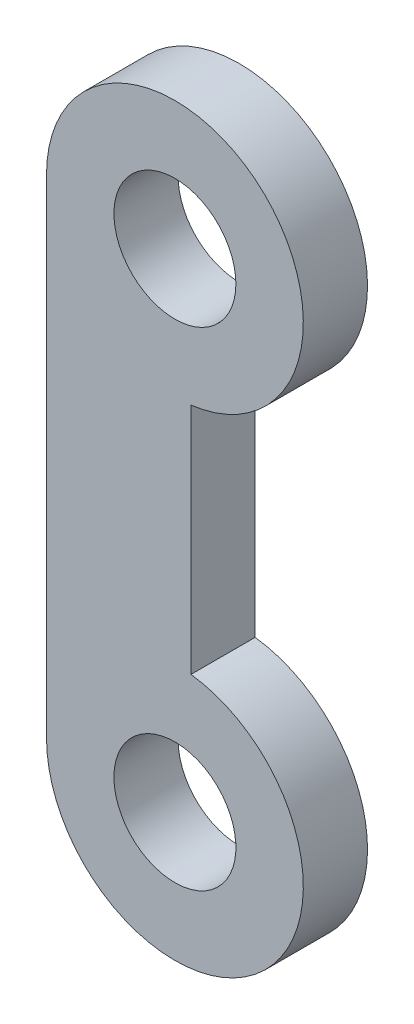
ISO-10303-21;
HEADER;
FILE_DESCRIPTION(('STEP AP214'),'2;1');
FILE_NAME('part.step','',(''),(''),'','','');
FILE_SCHEMA(('AUTOMOTIVE_DESIGN { 1 0 10303 214 1 1 1 1 }'));
ENDSEC;
DATA;
#1=APPLICATION_CONTEXT('core data for automotive mechanical design processes');
#2=APPLICATION_PROTOCOL_DEFINITION('international standard','automotive_design',2000,#1);
#3=PRODUCT_CONTEXT('',#1,'mechanical');
#4=PRODUCT('Part','Part','',(#3));
#5=PRODUCT_RELATED_PRODUCT_CATEGORY('part','',(#4));
#6=PRODUCT_DEFINITION_FORMATION('','',#4);
#7=PRODUCT_DEFINITION_CONTEXT('part definition',#1,'design');
#8=PRODUCT_DEFINITION('design','',#6,#7);
#9=PRODUCT_DEFINITION_SHAPE('','',#8);
#10=(LENGTH_UNIT() NAMED_UNIT(*) SI_UNIT(.MILLI.,.METRE.));
#11=(NAMED_UNIT(*) PLANE_ANGLE_UNIT() SI_UNIT($,.RADIAN.));
#12=(NAMED_UNIT(*) SI_UNIT($,.STERADIAN.) SOLID_ANGLE_UNIT());
#13=UNCERTAINTY_MEASURE_WITH_UNIT(LENGTH_MEASURE(1.E-05),#10,'distance_accuracy_value','');
#14=(GEOMETRIC_REPRESENTATION_CONTEXT(3) GLOBAL_UNCERTAINTY_ASSIGNED_CONTEXT((#13)) GLOBAL_UNIT_ASSIGNED_CONTEXT((#10,
#11,#12)) REPRESENTATION_CONTEXT('',''));
#15=CARTESIAN_POINT('',(0.,0.,0.));
#16=DIRECTION('',(0.,0.,1.));
#17=DIRECTION('',(1.,0.,0.));
#18=AXIS2_PLACEMENT_3D('',#15,#16,#17);
#19=CARTESIAN_POINT('',(-0.626223668804467,-7.60135566050591,2.));
#20=DIRECTION('',(0.,0.,1.));
#21=DIRECTION('',(1.,0.,0.));
#22=AXIS2_PLACEMENT_3D('',#19,#20,#21);
#23=PLANE('',#22);
#24=CARTESIAN_POINT('',(-0.626223668804467,7.60135566050591,2.));
#25=DIRECTION('',(0.,0.,1.));
#26=DIRECTION('',(1.,0.,0.));
#27=AXIS2_PLACEMENT_3D('',#24,#25,#26);
#28=CIRCLE('',#27,1.9);
#29=CARTESIAN_POINT('',(1.27377633119553,7.60135566050591,2.));
#30=VERTEX_POINT('',#29);
#31=EDGE_CURVE('E112',#30,#30,#28,.T.);
#32=ORIENTED_EDGE('',*,*,#31,.F.);
#33=EDGE_LOOP('',(#32));
#34=FACE_BOUND('',#33,.T.);
#35=CARTESIAN_POINT('',(-0.626223668804467,-7.60135566050591,2.));
#36=DIRECTION('',(0.,0.,1.));
#37=DIRECTION('',(1.,0.,0.));
#38=AXIS2_PLACEMENT_3D('',#35,#36,#37);
#39=CIRCLE('',#38,4.);
#40=CARTESIAN_POINT('',(-4.62622366880447,-7.60135566050591,2.));
#41=VERTEX_POINT('',#40);
#42=CARTESIAN_POINT('',(-0.126223668804468,-3.63272869390903,2.));
#43=VERTEX_POINT('',#42);
#44=EDGE_CURVE('E92',#41,#43,#39,.T.);
#45=ORIENTED_EDGE('',*,*,#44,.T.);
#46=DIRECTION('',(0.,1.,0.));
#47=VECTOR('',#46,1.);
#48=CARTESIAN_POINT('',(-0.126223668804468,3.63272869390903,2.));
#49=LINE('',#48,#47);
#50=CARTESIAN_POINT('',(-0.126223668804468,3.63272869390903,2.));
#51=VERTEX_POINT('',#50);
#52=EDGE_CURVE('E87',#43,#51,#49,.T.);
#53=ORIENTED_EDGE('',*,*,#52,.T.);
#54=CARTESIAN_POINT('',(-0.626223668804467,7.60135566050591,2.));
#55=DIRECTION('',(0.,0.,1.));
#56=DIRECTION('',(1.,0.,0.));
#57=AXIS2_PLACEMENT_3D('',#54,#55,#56);
#58=CIRCLE('',#57,4.);
#59=CARTESIAN_POINT('',(-4.62622366880447,7.60135566050591,2.));
#60=VERTEX_POINT('',#59);
#61=EDGE_CURVE('E90',#51,#60,#58,.T.);
#62=ORIENTED_EDGE('',*,*,#61,.T.);
#63=DIRECTION('',(0.,-1.,0.));
#64=VECTOR('',#63,1.);
#65=CARTESIAN_POINT('',(-4.62622366880447,7.60135566050591,2.));
#66=LINE('',#65,#64);
#67=EDGE_CURVE('E57',#60,#41,#66,.T.);
#68=ORIENTED_EDGE('',*,*,#67,.T.);
#69=EDGE_LOOP('',(#45,#53,#62,#68));
#70=FACE_BOUND('',#69,.T.);
#71=CARTESIAN_POINT('',(-0.626223668804467,-7.60135566050591,2.));
#72=DIRECTION('',(0.,0.,1.));
#73=DIRECTION('',(-1.,0.,0.));
#74=AXIS2_PLACEMENT_3D('',#71,#72,#73);
#75=CIRCLE('',#74,1.9);
#76=CARTESIAN_POINT('',(-2.52622366880447,-7.60135566050591,2.));
#77=VERTEX_POINT('',#76);
#78=EDGE_CURVE('E134',#77,#77,#75,.T.);
#79=ORIENTED_EDGE('',*,*,#78,.F.);
#80=EDGE_LOOP('',(#79));
#81=FACE_BOUND('',#80,.T.);
#82=ADVANCED_FACE('F39',(#34,#70,#81),#23,.T.);
#83=CARTESIAN_POINT('',(-0.626223668804467,-7.60135566050591,0.));
#84=DIRECTION('',(0.,0.,1.));
#85=DIRECTION('',(1.,0.,0.));
#86=AXIS2_PLACEMENT_3D('',#83,#84,#85);
#87=PLANE('',#86);
#88=CARTESIAN_POINT('',(-0.626223668804467,-7.60135566050591,0.));
#89=DIRECTION('',(0.,0.,1.));
#90=DIRECTION('',(1.,0.,0.));
#91=AXIS2_PLACEMENT_3D('',#88,#89,#90);
#92=CIRCLE('',#91,4.);
#93=CARTESIAN_POINT('',(-4.62622366880447,-7.60135566050591,0.));
#94=VERTEX_POINT('',#93);
#95=CARTESIAN_POINT('',(-0.126223668804468,-3.63272869390903,0.));
#96=VERTEX_POINT('',#95);
#97=EDGE_CURVE('E108',#94,#96,#92,.T.);
#98=ORIENTED_EDGE('',*,*,#97,.F.);
#99=DIRECTION('',(0.,-1.,0.));
#100=VECTOR('',#99,1.);
#101=CARTESIAN_POINT('',(-4.62622366880447,7.60135566050591,0.));
#102=LINE('',#101,#100);
#103=CARTESIAN_POINT('',(-4.62622366880447,7.60135566050591,0.));
#104=VERTEX_POINT('',#103);
#105=EDGE_CURVE('E80',#104,#94,#102,.T.);
#106=ORIENTED_EDGE('',*,*,#105,.F.);
#107=CARTESIAN_POINT('',(-0.626223668804467,7.60135566050591,0.));
#108=DIRECTION('',(0.,0.,1.));
#109=DIRECTION('',(1.,0.,0.));
#110=AXIS2_PLACEMENT_3D('',#107,#108,#109);
#111=CIRCLE('',#110,4.);
#112=CARTESIAN_POINT('',(-0.126223668804468,3.63272869390903,0.));
#113=VERTEX_POINT('',#112);
#114=EDGE_CURVE('E74',#113,#104,#111,.T.);
#115=ORIENTED_EDGE('',*,*,#114,.F.);
#116=DIRECTION('',(0.,1.,0.));
#117=VECTOR('',#116,1.);
#118=CARTESIAN_POINT('',(-0.126223668804468,3.63272869390903,0.));
#119=LINE('',#118,#117);
#120=EDGE_CURVE('E97',#96,#113,#119,.T.);
#121=ORIENTED_EDGE('',*,*,#120,.F.);
#122=EDGE_LOOP('',(#98,#106,#115,#121));
#123=FACE_BOUND('',#122,.T.);
#124=CARTESIAN_POINT('',(-0.626223668804467,7.60135566050591,0.));
#125=DIRECTION('',(0.,0.,1.));
#126=DIRECTION('',(1.,0.,0.));
#127=AXIS2_PLACEMENT_3D('',#124,#125,#126);
#128=CIRCLE('',#127,1.9);
#129=CARTESIAN_POINT('',(1.27377633119553,7.60135566050591,0.));
#130=VERTEX_POINT('',#129);
#131=EDGE_CURVE('E130',#130,#130,#128,.T.);
#132=ORIENTED_EDGE('',*,*,#131,.T.);
#133=EDGE_LOOP('',(#132));
#134=FACE_BOUND('',#133,.T.);
#135=CARTESIAN_POINT('',(-0.626223668804467,-7.60135566050591,0.));
#136=DIRECTION('',(0.,0.,1.));
#137=DIRECTION('',(-1.,0.,0.));
#138=AXIS2_PLACEMENT_3D('',#135,#136,#137);
#139=CIRCLE('',#138,1.9);
#140=CARTESIAN_POINT('',(-2.52622366880447,-7.60135566050591,0.));
#141=VERTEX_POINT('',#140);
#142=EDGE_CURVE('E138',#141,#141,#139,.T.);
#143=ORIENTED_EDGE('',*,*,#142,.T.);
#144=EDGE_LOOP('',(#143));
#145=FACE_BOUND('',#144,.T.);
#146=ADVANCED_FACE('F125',(#123,#134,#145),#87,.F.);
#147=CARTESIAN_POINT('',(-0.626223668804467,-7.60135566050591,2.));
#148=DIRECTION('',(0.,0.,-1.));
#149=DIRECTION('',(-1.,0.,0.));
#150=AXIS2_PLACEMENT_3D('',#147,#148,#149);
#151=CYLINDRICAL_SURFACE('',#150,4.);
#152=ORIENTED_EDGE('',*,*,#97,.T.);
#153=DIRECTION('',(0.,0.,-1.));
#154=VECTOR('',#153,1.);
#155=CARTESIAN_POINT('',(-0.126223668804468,-3.63272869390903,2.));
#156=LINE('',#155,#154);
#157=EDGE_CURVE('E11',#43,#96,#156,.T.);
#158=ORIENTED_EDGE('',*,*,#157,.F.);
#159=ORIENTED_EDGE('',*,*,#44,.F.);
#160=DIRECTION('',(0.,0.,-1.));
#161=VECTOR('',#160,1.);
#162=CARTESIAN_POINT('',(-4.62622366880447,-7.60135566050591,2.));
#163=LINE('',#162,#161);
#164=EDGE_CURVE('E104',#41,#94,#163,.T.);
#165=ORIENTED_EDGE('',*,*,#164,.T.);
#166=EDGE_LOOP('',(#152,#158,#159,#165));
#167=FACE_BOUND('',#166,.T.);
#168=ADVANCED_FACE('F41',(#167),#151,.T.);
#169=CARTESIAN_POINT('',(-0.126223668804468,3.63272869390903,2.));
#170=DIRECTION('',(-1.,0.,0.));
#171=DIRECTION('',(0.,0.,1.));
#172=AXIS2_PLACEMENT_3D('',#169,#170,#171);
#173=PLANE('',#172);
#174=ORIENTED_EDGE('',*,*,#120,.T.);
#175=DIRECTION('',(0.,0.,-1.));
#176=VECTOR('',#175,1.);
#177=CARTESIAN_POINT('',(-0.126223668804468,3.63272869390903,2.));
#178=LINE('',#177,#176);
#179=EDGE_CURVE('E49',#51,#113,#178,.T.);
#180=ORIENTED_EDGE('',*,*,#179,.F.);
#181=ORIENTED_EDGE('',*,*,#52,.F.);
#182=ORIENTED_EDGE('',*,*,#157,.T.);
#183=EDGE_LOOP('',(#174,#180,#181,#182));
#184=FACE_BOUND('',#183,.T.);
#185=ADVANCED_FACE('F96',(#184),#173,.F.);
#186=CARTESIAN_POINT('',(-0.626223668804467,7.60135566050591,2.));
#187=DIRECTION('',(0.,0.,-1.));
#188=DIRECTION('',(-1.,0.,0.));
#189=AXIS2_PLACEMENT_3D('',#186,#187,#188);
#190=CYLINDRICAL_SURFACE('',#189,4.);
#191=ORIENTED_EDGE('',*,*,#114,.T.);
#192=DIRECTION('',(0.,0.,-1.));
#193=VECTOR('',#192,1.);
#194=CARTESIAN_POINT('',(-4.62622366880447,7.60135566050591,2.));
#195=LINE('',#194,#193);
#196=EDGE_CURVE('E99',#60,#104,#195,.T.);
#197=ORIENTED_EDGE('',*,*,#196,.F.);
#198=ORIENTED_EDGE('',*,*,#61,.F.);
#199=ORIENTED_EDGE('',*,*,#179,.T.);
#200=EDGE_LOOP('',(#191,#197,#198,#199));
#201=FACE_BOUND('',#200,.T.);
#202=ADVANCED_FACE('F100',(#201),#190,.T.);
#203=CARTESIAN_POINT('',(-4.62622366880447,7.60135566050591,2.));
#204=DIRECTION('',(1.,0.,0.));
#205=DIRECTION('',(0.,0.,-1.));
#206=AXIS2_PLACEMENT_3D('',#203,#204,#205);
#207=PLANE('',#206);
#208=ORIENTED_EDGE('',*,*,#105,.T.);
#209=ORIENTED_EDGE('',*,*,#164,.F.);
#210=ORIENTED_EDGE('',*,*,#67,.F.);
#211=ORIENTED_EDGE('',*,*,#196,.T.);
#212=EDGE_LOOP('',(#208,#209,#210,#211));
#213=FACE_BOUND('',#212,.T.);
#214=ADVANCED_FACE('F122',(#213),#207,.F.);
#215=CARTESIAN_POINT('',(-0.626223668804467,7.60135566050591,2.));
#216=DIRECTION('',(0.,0.,-1.));
#217=DIRECTION('',(-1.,0.,0.));
#218=AXIS2_PLACEMENT_3D('',#215,#216,#217);
#219=CYLINDRICAL_SURFACE('',#218,1.9);
#220=ORIENTED_EDGE('',*,*,#31,.T.);
#221=EDGE_LOOP('',(#220));
#222=FACE_BOUND('',#221,.T.);
#223=ORIENTED_EDGE('',*,*,#131,.F.);
#224=EDGE_LOOP('',(#223));
#225=FACE_BOUND('',#224,.T.);
#226=ADVANCED_FACE('F157',(#222,#225),#219,.F.);
#227=CARTESIAN_POINT('',(-0.626223668804467,-7.60135566050591,2.));
#228=DIRECTION('',(0.,0.,-1.));
#229=DIRECTION('',(-1.,0.,0.));
#230=AXIS2_PLACEMENT_3D('',#227,#228,#229);
#231=CYLINDRICAL_SURFACE('',#230,1.9);
#232=ORIENTED_EDGE('',*,*,#78,.T.);
#233=EDGE_LOOP('',(#232));
#234=FACE_BOUND('',#233,.T.);
#235=ORIENTED_EDGE('',*,*,#142,.F.);
#236=EDGE_LOOP('',(#235));
#237=FACE_BOUND('',#236,.T.);
#238=ADVANCED_FACE('F146',(#234,#237),#231,.F.);
#239=CLOSED_SHELL('',(#82,#146,#168,#185,#202,#214,#226,#238));
#240=MANIFOLD_SOLID_BREP('B2',#239);
#241=ADVANCED_BREP_SHAPE_REPRESENTATION('',(#18,#240),#14);
#242=SHAPE_DEFINITION_REPRESENTATION(#9,#241);
ENDSEC;
END-ISO-10303-21;
